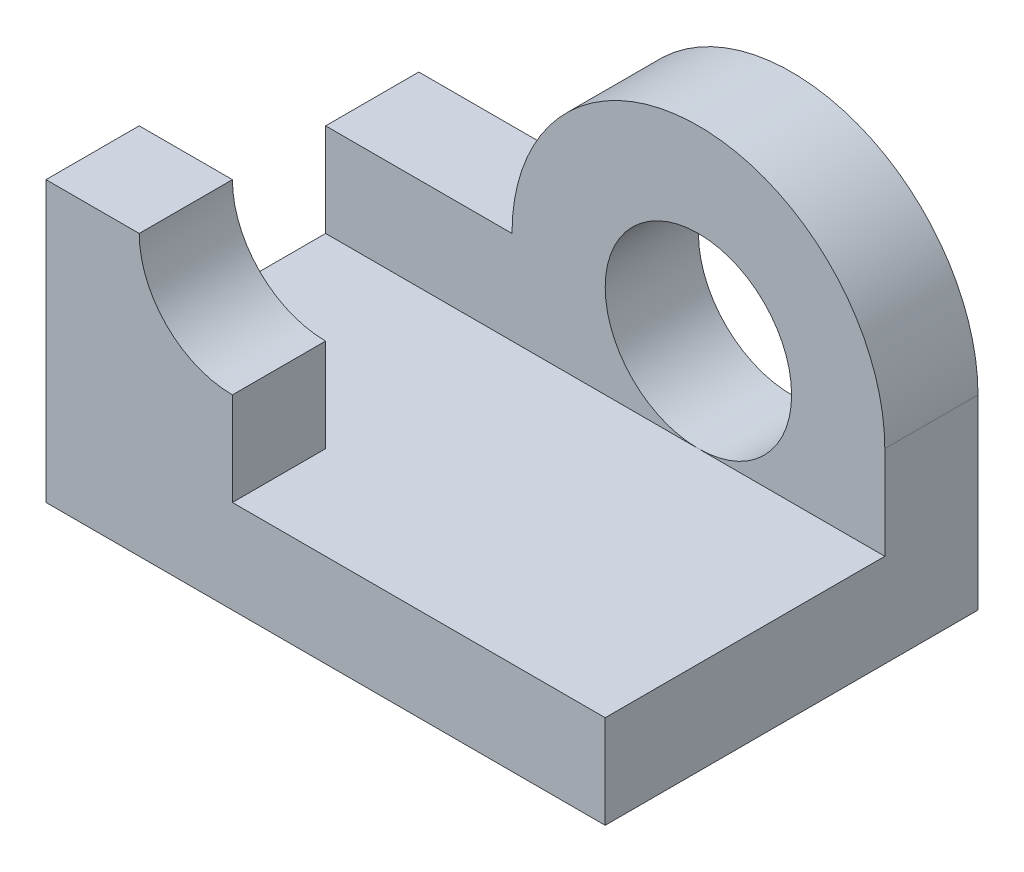
ISO-10303-21;
HEADER;
FILE_DESCRIPTION(('STEP AP214'),'2;1');
FILE_NAME('part.step','',(''),(''),'','','');
FILE_SCHEMA(('AUTOMOTIVE_DESIGN { 1 0 10303 214 1 1 1 1 }'));
ENDSEC;
DATA;
#1=APPLICATION_CONTEXT('core data for automotive mechanical design processes');
#2=APPLICATION_PROTOCOL_DEFINITION('international standard','automotive_design',2000,#1);
#3=PRODUCT_CONTEXT('',#1,'mechanical');
#4=PRODUCT('Part','Part','',(#3));
#5=PRODUCT_RELATED_PRODUCT_CATEGORY('part','',(#4));
#6=PRODUCT_DEFINITION_FORMATION('','',#4);
#7=PRODUCT_DEFINITION_CONTEXT('part definition',#1,'design');
#8=PRODUCT_DEFINITION('design','',#6,#7);
#9=PRODUCT_DEFINITION_SHAPE('','',#8);
#10=(LENGTH_UNIT() NAMED_UNIT(*) SI_UNIT(.MILLI.,.METRE.));
#11=(NAMED_UNIT(*) PLANE_ANGLE_UNIT() SI_UNIT($,.RADIAN.));
#12=(NAMED_UNIT(*) SI_UNIT($,.STERADIAN.) SOLID_ANGLE_UNIT());
#13=UNCERTAINTY_MEASURE_WITH_UNIT(LENGTH_MEASURE(1.E-05),#10,'distance_accuracy_value','');
#14=(GEOMETRIC_REPRESENTATION_CONTEXT(3) GLOBAL_UNCERTAINTY_ASSIGNED_CONTEXT((#13)) GLOBAL_UNIT_ASSIGNED_CONTEXT((#10,
#11,#12)) REPRESENTATION_CONTEXT('',''));
#15=CARTESIAN_POINT('',(0.,0.,0.));
#16=DIRECTION('',(0.,0.,1.));
#17=DIRECTION('',(1.,0.,0.));
#18=AXIS2_PLACEMENT_3D('',#15,#16,#17);
#19=CARTESIAN_POINT('',(0.,10.,-40.));
#20=DIRECTION('',(0.,1.,0.));
#21=DIRECTION('',(-1.,0.,0.));
#22=AXIS2_PLACEMENT_3D('',#19,#20,#21);
#23=PLANE('',#22);
#24=DIRECTION('',(0.,0.,1.));
#25=VECTOR('',#24,1.);
#26=CARTESIAN_POINT('',(-40.,9.99999999999999,-10.));
#27=LINE('',#26,#25);
#28=CARTESIAN_POINT('',(-40.,9.99999999999999,-10.));
#29=VERTEX_POINT('',#28);
#30=CARTESIAN_POINT('',(-40.,9.99999999999999,0.));
#31=VERTEX_POINT('',#30);
#32=EDGE_CURVE('E125',#29,#31,#27,.T.);
#33=ORIENTED_EDGE('',*,*,#32,.T.);
#34=DIRECTION('',(-1.,0.,0.));
#35=VECTOR('',#34,1.);
#36=CARTESIAN_POINT('',(0.,10.,0.));
#37=LINE('',#36,#35);
#38=CARTESIAN_POINT('',(0.,10.,0.));
#39=VERTEX_POINT('',#38);
#40=EDGE_CURVE('E235',#39,#31,#37,.T.);
#41=ORIENTED_EDGE('',*,*,#40,.F.);
#42=DIRECTION('',(0.,0.,1.));
#43=VECTOR('',#42,1.);
#44=CARTESIAN_POINT('',(0.,10.,-40.));
#45=LINE('',#44,#43);
#46=CARTESIAN_POINT('',(0.,10.,-30.));
#47=VERTEX_POINT('',#46);
#48=EDGE_CURVE('E231',#47,#39,#45,.T.);
#49=ORIENTED_EDGE('',*,*,#48,.F.);
#50=DIRECTION('',(-1.,0.,0.));
#51=VECTOR('',#50,1.);
#52=CARTESIAN_POINT('',(0.,10.,-30.));
#53=LINE('',#52,#51);
#54=CARTESIAN_POINT('',(-20.,10.,-30.));
#55=VERTEX_POINT('',#54);
#56=EDGE_CURVE('E11',#47,#55,#53,.T.);
#57=ORIENTED_EDGE('',*,*,#56,.T.);
#58=CARTESIAN_POINT('',(-60.,9.99999999999999,-30.));
#59=VERTEX_POINT('',#58);
#60=EDGE_CURVE('E49',#55,#59,#53,.T.);
#61=ORIENTED_EDGE('',*,*,#60,.T.);
#62=DIRECTION('',(0.,0.,1.));
#63=VECTOR('',#62,1.);
#64=CARTESIAN_POINT('',(-60.,9.99999999999999,-40.));
#65=LINE('',#64,#63);
#66=CARTESIAN_POINT('',(-60.,9.99999999999999,-10.));
#67=VERTEX_POINT('',#66);
#68=EDGE_CURVE('E149',#59,#67,#65,.T.);
#69=ORIENTED_EDGE('',*,*,#68,.T.);
#70=DIRECTION('',(1.,0.,0.));
#71=VECTOR('',#70,1.);
#72=CARTESIAN_POINT('',(-60.,9.99999999999999,-10.));
#73=LINE('',#72,#71);
#74=EDGE_CURVE('E142',#67,#29,#73,.T.);
#75=ORIENTED_EDGE('',*,*,#74,.T.);
#76=EDGE_LOOP('',(#33,#41,#49,#57,#61,#69,#75));
#77=FACE_BOUND('',#76,.T.);
#78=ADVANCED_FACE('F39',(#77),#23,.T.);
#79=CARTESIAN_POINT('',(0.,0.,-40.));
#80=DIRECTION('',(1.,0.,0.));
#81=DIRECTION('',(0.,0.,-1.));
#82=AXIS2_PLACEMENT_3D('',#79,#80,#81);
#83=PLANE('',#82);
#84=DIRECTION('',(0.,-1.,0.));
#85=VECTOR('',#84,1.);
#86=CARTESIAN_POINT('',(0.,10.,-30.));
#87=LINE('',#86,#85);
#88=CARTESIAN_POINT('',(0.,20.,-30.));
#89=VERTEX_POINT('',#88);
#90=EDGE_CURVE('E184',#89,#47,#87,.T.);
#91=ORIENTED_EDGE('',*,*,#90,.T.);
#92=ORIENTED_EDGE('',*,*,#48,.T.);
#93=DIRECTION('',(0.,1.,0.));
#94=VECTOR('',#93,1.);
#95=CARTESIAN_POINT('',(0.,0.,0.));
#96=LINE('',#95,#94);
#97=CARTESIAN_POINT('',(0.,0.,0.));
#98=VERTEX_POINT('',#97);
#99=EDGE_CURVE('E212',#98,#39,#96,.T.);
#100=ORIENTED_EDGE('',*,*,#99,.F.);
#101=DIRECTION('',(0.,0.,1.));
#102=VECTOR('',#101,1.);
#103=CARTESIAN_POINT('',(0.,0.,-40.));
#104=LINE('',#103,#102);
#105=CARTESIAN_POINT('',(0.,0.,-40.));
#106=VERTEX_POINT('',#105);
#107=EDGE_CURVE('E245',#106,#98,#104,.T.);
#108=ORIENTED_EDGE('',*,*,#107,.F.);
#109=DIRECTION('',(0.,1.,0.));
#110=VECTOR('',#109,1.);
#111=CARTESIAN_POINT('',(0.,0.,-40.));
#112=LINE('',#111,#110);
#113=CARTESIAN_POINT('',(0.,20.,-40.));
#114=VERTEX_POINT('',#113);
#115=EDGE_CURVE('E219',#106,#114,#112,.T.);
#116=ORIENTED_EDGE('',*,*,#115,.T.);
#117=DIRECTION('',(0.,0.,-1.));
#118=VECTOR('',#117,1.);
#119=CARTESIAN_POINT('',(0.,20.,-30.));
#120=LINE('',#119,#118);
#121=EDGE_CURVE('E208',#89,#114,#120,.T.);
#122=ORIENTED_EDGE('',*,*,#121,.F.);
#123=EDGE_LOOP('',(#91,#92,#100,#108,#116,#122));
#124=FACE_BOUND('',#123,.T.);
#125=ADVANCED_FACE('F41',(#124),#83,.T.);
#126=CARTESIAN_POINT('',(0.,0.,-40.));
#127=DIRECTION('',(0.,-1.,0.));
#128=DIRECTION('',(0.,0.,-1.));
#129=AXIS2_PLACEMENT_3D('',#126,#127,#128);
#130=PLANE('',#129);
#131=ORIENTED_EDGE('',*,*,#107,.T.);
#132=DIRECTION('',(1.,0.,0.));
#133=VECTOR('',#132,1.);
#134=CARTESIAN_POINT('',(0.,0.,0.));
#135=LINE('',#134,#133);
#136=CARTESIAN_POINT('',(-60.,0.,0.));
#137=VERTEX_POINT('',#136);
#138=EDGE_CURVE('E223',#137,#98,#135,.T.);
#139=ORIENTED_EDGE('',*,*,#138,.F.);
#140=DIRECTION('',(0.,0.,1.));
#141=VECTOR('',#140,1.);
#142=CARTESIAN_POINT('',(-60.,0.,-40.));
#143=LINE('',#142,#141);
#144=CARTESIAN_POINT('',(-60.,0.,-40.));
#145=VERTEX_POINT('',#144);
#146=EDGE_CURVE('E248',#145,#137,#143,.T.);
#147=ORIENTED_EDGE('',*,*,#146,.F.);
#148=DIRECTION('',(1.,0.,0.));
#149=VECTOR('',#148,1.);
#150=CARTESIAN_POINT('',(0.,0.,-40.));
#151=LINE('',#150,#149);
#152=EDGE_CURVE('E227',#145,#106,#151,.T.);
#153=ORIENTED_EDGE('',*,*,#152,.T.);
#154=EDGE_LOOP('',(#131,#139,#147,#153));
#155=FACE_BOUND('',#154,.T.);
#156=ADVANCED_FACE('F262',(#155),#130,.T.);
#157=CARTESIAN_POINT('',(-60.,0.,-40.));
#158=DIRECTION('',(-1.,0.,0.));
#159=DIRECTION('',(0.,0.,1.));
#160=AXIS2_PLACEMENT_3D('',#157,#158,#159);
#161=PLANE('',#160);
#162=ORIENTED_EDGE('',*,*,#146,.T.);
#163=DIRECTION('',(0.,-1.,0.));
#164=VECTOR('',#163,1.);
#165=CARTESIAN_POINT('',(-60.,0.,0.));
#166=LINE('',#165,#164);
#167=CARTESIAN_POINT('',(-60.,30.,0.));
#168=VERTEX_POINT('',#167);
#169=EDGE_CURVE('E238',#168,#137,#166,.T.);
#170=ORIENTED_EDGE('',*,*,#169,.F.);
#171=DIRECTION('',(0.,0.,1.));
#172=VECTOR('',#171,1.);
#173=CARTESIAN_POINT('',(-60.,30.,-10.));
#174=LINE('',#173,#172);
#175=CARTESIAN_POINT('',(-60.,30.,-10.));
#176=VERTEX_POINT('',#175);
#177=EDGE_CURVE('E171',#176,#168,#174,.T.);
#178=ORIENTED_EDGE('',*,*,#177,.F.);
#179=DIRECTION('',(0.,-1.,0.));
#180=VECTOR('',#179,1.);
#181=CARTESIAN_POINT('',(-60.,9.99999999999999,-10.));
#182=LINE('',#181,#180);
#183=EDGE_CURVE('E136',#176,#67,#182,.T.);
#184=ORIENTED_EDGE('',*,*,#183,.T.);
#185=ORIENTED_EDGE('',*,*,#68,.F.);
#186=DIRECTION('',(0.,1.,0.));
#187=VECTOR('',#186,1.);
#188=CARTESIAN_POINT('',(-60.,0.,-30.));
#189=LINE('',#188,#187);
#190=CARTESIAN_POINT('',(-60.,20.,-30.));
#191=VERTEX_POINT('',#190);
#192=EDGE_CURVE('E188',#59,#191,#189,.T.);
#193=ORIENTED_EDGE('',*,*,#192,.T.);
#194=DIRECTION('',(0.,0.,-1.));
#195=VECTOR('',#194,1.);
#196=CARTESIAN_POINT('',(-60.,20.,-30.));
#197=LINE('',#196,#195);
#198=CARTESIAN_POINT('',(-60.,20.,-40.));
#199=VERTEX_POINT('',#198);
#200=EDGE_CURVE('E200',#191,#199,#197,.T.);
#201=ORIENTED_EDGE('',*,*,#200,.T.);
#202=DIRECTION('',(0.,-1.,0.));
#203=VECTOR('',#202,1.);
#204=CARTESIAN_POINT('',(-60.,0.,-40.));
#205=LINE('',#204,#203);
#206=EDGE_CURVE('E222',#199,#145,#205,.T.);
#207=ORIENTED_EDGE('',*,*,#206,.T.);
#208=EDGE_LOOP('',(#162,#170,#178,#184,#185,#193,#201,#207));
#209=FACE_BOUND('',#208,.T.);
#210=ADVANCED_FACE('F280',(#209),#161,.T.);
#211=CARTESIAN_POINT('',(0.,0.,-40.));
#212=DIRECTION('',(0.,0.,1.));
#213=DIRECTION('',(1.,0.,0.));
#214=AXIS2_PLACEMENT_3D('',#211,#212,#213);
#215=PLANE('',#214);
#216=CARTESIAN_POINT('',(-20.,20.,-40.));
#217=DIRECTION('',(0.,0.,-1.));
#218=DIRECTION('',(-1.,0.,0.));
#219=AXIS2_PLACEMENT_3D('',#216,#217,#218);
#220=CIRCLE('',#219,10.);
#221=CARTESIAN_POINT('',(-30.,20.,-40.));
#222=VERTEX_POINT('',#221);
#223=EDGE_CURVE('E175',#222,#222,#220,.T.);
#224=ORIENTED_EDGE('',*,*,#223,.F.);
#225=EDGE_LOOP('',(#224));
#226=FACE_BOUND('',#225,.T.);
#227=ORIENTED_EDGE('',*,*,#115,.F.);
#228=ORIENTED_EDGE('',*,*,#152,.F.);
#229=ORIENTED_EDGE('',*,*,#206,.F.);
#230=DIRECTION('',(1.,0.,0.));
#231=VECTOR('',#230,1.);
#232=CARTESIAN_POINT('',(-60.,20.,-40.));
#233=LINE('',#232,#231);
#234=CARTESIAN_POINT('',(-40.,20.,-40.));
#235=VERTEX_POINT('',#234);
#236=EDGE_CURVE('E201',#199,#235,#233,.T.);
#237=ORIENTED_EDGE('',*,*,#236,.T.);
#238=CARTESIAN_POINT('',(-20.,20.,-40.));
#239=DIRECTION('',(0.,0.,-1.));
#240=DIRECTION('',(-1.,0.,0.));
#241=AXIS2_PLACEMENT_3D('',#238,#239,#240);
#242=CIRCLE('',#241,20.);
#243=EDGE_CURVE('E189',#235,#114,#242,.T.);
#244=ORIENTED_EDGE('',*,*,#243,.T.);
#245=EDGE_LOOP('',(#227,#228,#229,#237,#244));
#246=FACE_BOUND('',#245,.T.);
#247=ADVANCED_FACE('F266',(#226,#246),#215,.F.);
#248=CARTESIAN_POINT('',(0.,0.,0.));
#249=DIRECTION('',(0.,0.,1.));
#250=DIRECTION('',(1.,0.,0.));
#251=AXIS2_PLACEMENT_3D('',#248,#249,#250);
#252=PLANE('',#251);
#253=ORIENTED_EDGE('',*,*,#99,.T.);
#254=ORIENTED_EDGE('',*,*,#40,.T.);
#255=DIRECTION('',(0.,1.,0.));
#256=VECTOR('',#255,1.);
#257=CARTESIAN_POINT('',(-40.,9.99999999999999,0.));
#258=LINE('',#257,#256);
#259=CARTESIAN_POINT('',(-40.,20.,0.));
#260=VERTEX_POINT('',#259);
#261=EDGE_CURVE('E130',#31,#260,#258,.T.);
#262=ORIENTED_EDGE('',*,*,#261,.T.);
#263=CARTESIAN_POINT('',(-40.,30.,0.));
#264=DIRECTION('',(0.,0.,-1.));
#265=DIRECTION('',(1.,0.,0.));
#266=AXIS2_PLACEMENT_3D('',#263,#264,#265);
#267=CIRCLE('',#266,9.99999999999999);
#268=CARTESIAN_POINT('',(-50.,30.,0.));
#269=VERTEX_POINT('',#268);
#270=EDGE_CURVE('E155',#260,#269,#267,.T.);
#271=ORIENTED_EDGE('',*,*,#270,.T.);
#272=DIRECTION('',(-1.,0.,0.));
#273=VECTOR('',#272,1.);
#274=CARTESIAN_POINT('',(-60.,30.,0.));
#275=LINE('',#274,#273);
#276=EDGE_CURVE('E151',#269,#168,#275,.T.);
#277=ORIENTED_EDGE('',*,*,#276,.T.);
#278=ORIENTED_EDGE('',*,*,#169,.T.);
#279=ORIENTED_EDGE('',*,*,#138,.T.);
#280=EDGE_LOOP('',(#253,#254,#262,#271,#277,#278,#279));
#281=FACE_BOUND('',#280,.T.);
#282=ADVANCED_FACE('F259',(#281),#252,.T.);
#283=CARTESIAN_POINT('',(-20.,20.,-30.));
#284=DIRECTION('',(0.,0.,-1.));
#285=DIRECTION('',(-1.,0.,0.));
#286=AXIS2_PLACEMENT_3D('',#283,#284,#285);
#287=CYLINDRICAL_SURFACE('',#286,20.);
#288=ORIENTED_EDGE('',*,*,#243,.F.);
#289=DIRECTION('',(0.,0.,-1.));
#290=VECTOR('',#289,1.);
#291=CARTESIAN_POINT('',(-40.,20.,-30.));
#292=LINE('',#291,#290);
#293=CARTESIAN_POINT('',(-40.,20.,-30.));
#294=VERTEX_POINT('',#293);
#295=EDGE_CURVE('E213',#294,#235,#292,.T.);
#296=ORIENTED_EDGE('',*,*,#295,.F.);
#297=CARTESIAN_POINT('',(-20.,20.,-30.));
#298=DIRECTION('',(0.,0.,-1.));
#299=DIRECTION('',(-1.,0.,0.));
#300=AXIS2_PLACEMENT_3D('',#297,#298,#299);
#301=CIRCLE('',#300,20.);
#302=EDGE_CURVE('E196',#294,#89,#301,.T.);
#303=ORIENTED_EDGE('',*,*,#302,.T.);
#304=ORIENTED_EDGE('',*,*,#121,.T.);
#305=EDGE_LOOP('',(#288,#296,#303,#304));
#306=FACE_BOUND('',#305,.T.);
#307=ADVANCED_FACE('F270',(#306),#287,.T.);
#308=CARTESIAN_POINT('',(-60.,20.,-30.));
#309=DIRECTION('',(0.,1.,0.));
#310=DIRECTION('',(0.,0.,1.));
#311=AXIS2_PLACEMENT_3D('',#308,#309,#310);
#312=PLANE('',#311);
#313=ORIENTED_EDGE('',*,*,#236,.F.);
#314=ORIENTED_EDGE('',*,*,#200,.F.);
#315=DIRECTION('',(1.,0.,0.));
#316=VECTOR('',#315,1.);
#317=CARTESIAN_POINT('',(-60.,20.,-30.));
#318=LINE('',#317,#316);
#319=EDGE_CURVE('E192',#191,#294,#318,.T.);
#320=ORIENTED_EDGE('',*,*,#319,.T.);
#321=ORIENTED_EDGE('',*,*,#295,.T.);
#322=EDGE_LOOP('',(#313,#314,#320,#321));
#323=FACE_BOUND('',#322,.T.);
#324=ADVANCED_FACE('F278',(#323),#312,.T.);
#325=CARTESIAN_POINT('',(-20.,20.,-30.));
#326=DIRECTION('',(0.,0.,-1.));
#327=DIRECTION('',(-1.,0.,0.));
#328=AXIS2_PLACEMENT_3D('',#325,#326,#327);
#329=PLANE('',#328);
#330=ORIENTED_EDGE('',*,*,#60,.F.);
#331=CARTESIAN_POINT('',(-20.,20.,-30.));
#332=DIRECTION('',(0.,0.,-1.));
#333=DIRECTION('',(-1.,0.,0.));
#334=AXIS2_PLACEMENT_3D('',#331,#332,#333);
#335=CIRCLE('',#334,10.);
#336=EDGE_CURVE('E43',#55,#55,#335,.T.);
#337=ORIENTED_EDGE('',*,*,#336,.T.);
#338=ORIENTED_EDGE('',*,*,#56,.F.);
#339=ORIENTED_EDGE('',*,*,#90,.F.);
#340=ORIENTED_EDGE('',*,*,#302,.F.);
#341=ORIENTED_EDGE('',*,*,#319,.F.);
#342=ORIENTED_EDGE('',*,*,#192,.F.);
#343=EDGE_LOOP('',(#330,#337,#338,#339,#340,#341,#342));
#344=FACE_BOUND('',#343,.T.);
#345=ADVANCED_FACE('F274',(#344),#329,.F.);
#346=CARTESIAN_POINT('',(-20.,20.,0.));
#347=DIRECTION('',(0.,0.,-1.));
#348=DIRECTION('',(-1.,0.,0.));
#349=AXIS2_PLACEMENT_3D('',#346,#347,#348);
#350=CYLINDRICAL_SURFACE('',#349,10.);
#351=ORIENTED_EDGE('',*,*,#223,.T.);
#352=EDGE_LOOP('',(#351));
#353=FACE_BOUND('',#352,.T.);
#354=ORIENTED_EDGE('',*,*,#336,.F.);
#355=EDGE_LOOP('',(#354));
#356=FACE_BOUND('',#355,.T.);
#357=ADVANCED_FACE('F290',(#353,#356),#350,.F.);
#358=CARTESIAN_POINT('',(-60.,30.,-10.));
#359=DIRECTION('',(0.,1.,0.));
#360=DIRECTION('',(0.,0.,1.));
#361=AXIS2_PLACEMENT_3D('',#358,#359,#360);
#362=PLANE('',#361);
#363=ORIENTED_EDGE('',*,*,#276,.F.);
#364=DIRECTION('',(0.,0.,1.));
#365=VECTOR('',#364,1.);
#366=CARTESIAN_POINT('',(-50.,30.,-10.));
#367=LINE('',#366,#365);
#368=CARTESIAN_POINT('',(-50.,30.,-10.));
#369=VERTEX_POINT('',#368);
#370=EDGE_CURVE('E176',#369,#269,#367,.T.);
#371=ORIENTED_EDGE('',*,*,#370,.F.);
#372=DIRECTION('',(-1.,0.,0.));
#373=VECTOR('',#372,1.);
#374=CARTESIAN_POINT('',(-60.,30.,-10.));
#375=LINE('',#374,#373);
#376=EDGE_CURVE('E160',#369,#176,#375,.T.);
#377=ORIENTED_EDGE('',*,*,#376,.T.);
#378=ORIENTED_EDGE('',*,*,#177,.T.);
#379=EDGE_LOOP('',(#363,#371,#377,#378));
#380=FACE_BOUND('',#379,.T.);
#381=ADVANCED_FACE('F288',(#380),#362,.T.);
#382=CARTESIAN_POINT('',(-40.,30.,-10.));
#383=DIRECTION('',(0.,0.,1.));
#384=DIRECTION('',(1.,0.,0.));
#385=AXIS2_PLACEMENT_3D('',#382,#383,#384);
#386=CYLINDRICAL_SURFACE('',#385,9.99999999999999);
#387=ORIENTED_EDGE('',*,*,#270,.F.);
#388=DIRECTION('',(0.,0.,1.));
#389=VECTOR('',#388,1.);
#390=CARTESIAN_POINT('',(-40.,20.,-10.));
#391=LINE('',#390,#389);
#392=CARTESIAN_POINT('',(-40.,20.,-10.));
#393=VERTEX_POINT('',#392);
#394=EDGE_CURVE('E135',#393,#260,#391,.T.);
#395=ORIENTED_EDGE('',*,*,#394,.F.);
#396=CARTESIAN_POINT('',(-40.,30.,-10.));
#397=DIRECTION('',(0.,0.,-1.));
#398=DIRECTION('',(1.,0.,0.));
#399=AXIS2_PLACEMENT_3D('',#396,#397,#398);
#400=CIRCLE('',#399,9.99999999999999);
#401=EDGE_CURVE('E146',#393,#369,#400,.T.);
#402=ORIENTED_EDGE('',*,*,#401,.T.);
#403=ORIENTED_EDGE('',*,*,#370,.T.);
#404=EDGE_LOOP('',(#387,#395,#402,#403));
#405=FACE_BOUND('',#404,.T.);
#406=ADVANCED_FACE('F286',(#405),#386,.F.);
#407=CARTESIAN_POINT('',(-40.,9.99999999999999,-10.));
#408=DIRECTION('',(1.,0.,0.));
#409=DIRECTION('',(0.,0.,-1.));
#410=AXIS2_PLACEMENT_3D('',#407,#408,#409);
#411=PLANE('',#410);
#412=ORIENTED_EDGE('',*,*,#261,.F.);
#413=ORIENTED_EDGE('',*,*,#32,.F.);
#414=DIRECTION('',(0.,1.,0.));
#415=VECTOR('',#414,1.);
#416=CARTESIAN_POINT('',(-40.,9.99999999999999,-10.));
#417=LINE('',#416,#415);
#418=EDGE_CURVE('E128',#29,#393,#417,.T.);
#419=ORIENTED_EDGE('',*,*,#418,.T.);
#420=ORIENTED_EDGE('',*,*,#394,.T.);
#421=EDGE_LOOP('',(#412,#413,#419,#420));
#422=FACE_BOUND('',#421,.T.);
#423=ADVANCED_FACE('F127',(#422),#411,.T.);
#424=CARTESIAN_POINT('',(-40.,30.,-10.));
#425=DIRECTION('',(0.,0.,1.));
#426=DIRECTION('',(1.,0.,0.));
#427=AXIS2_PLACEMENT_3D('',#424,#425,#426);
#428=PLANE('',#427);
#429=ORIENTED_EDGE('',*,*,#74,.F.);
#430=ORIENTED_EDGE('',*,*,#183,.F.);
#431=ORIENTED_EDGE('',*,*,#376,.F.);
#432=ORIENTED_EDGE('',*,*,#401,.F.);
#433=ORIENTED_EDGE('',*,*,#418,.F.);
#434=EDGE_LOOP('',(#429,#430,#431,#432,#433));
#435=FACE_BOUND('',#434,.T.);
#436=ADVANCED_FACE('F140',(#435),#428,.F.);
#437=CLOSED_SHELL('',(#78,#125,#156,#210,#247,#282,#307,#324,#345,#357,#381,#406,#423,#436));
#438=MANIFOLD_SOLID_BREP('B2',#437);
#439=ADVANCED_BREP_SHAPE_REPRESENTATION('',(#18,#438),#14);
#440=SHAPE_DEFINITION_REPRESENTATION(#9,#439);
ENDSEC;
END-ISO-10303-21;
